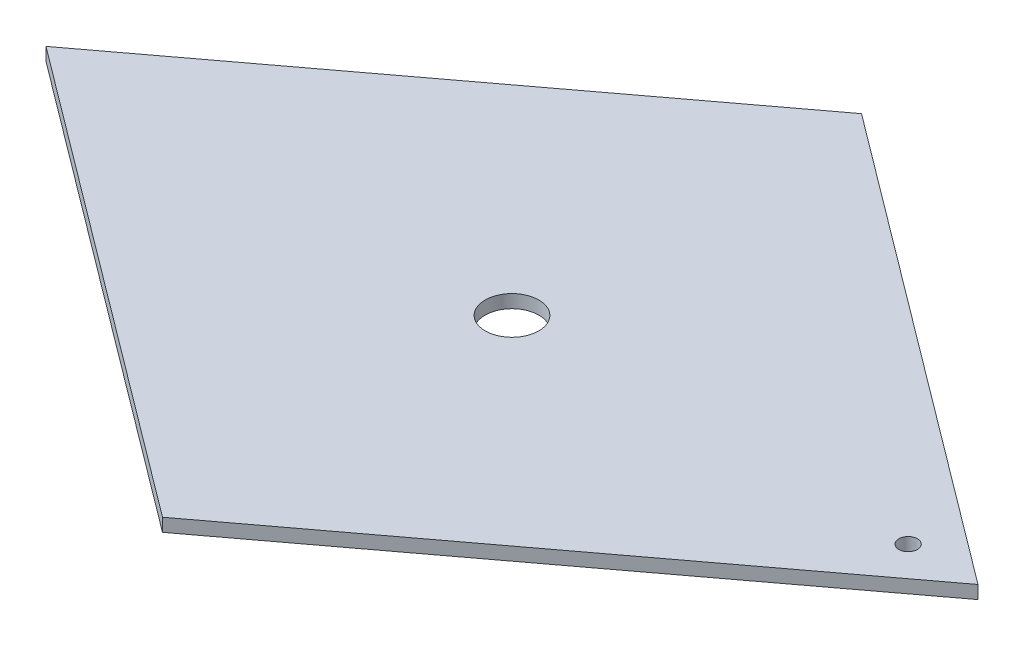
ISO-10303-21;
HEADER;
FILE_DESCRIPTION(('STEP AP214'),'2;1');
FILE_NAME('part.step','',(''),(''),'','','');
FILE_SCHEMA(('AUTOMOTIVE_DESIGN { 1 0 10303 214 1 1 1 1 }'));
ENDSEC;
DATA;
#1=APPLICATION_CONTEXT('core data for automotive mechanical design processes');
#2=APPLICATION_PROTOCOL_DEFINITION('international standard','automotive_design',2000,#1);
#3=PRODUCT_CONTEXT('',#1,'mechanical');
#4=PRODUCT('Part','Part','',(#3));
#5=PRODUCT_RELATED_PRODUCT_CATEGORY('part','',(#4));
#6=PRODUCT_DEFINITION_FORMATION('','',#4);
#7=PRODUCT_DEFINITION_CONTEXT('part definition',#1,'design');
#8=PRODUCT_DEFINITION('design','',#6,#7);
#9=PRODUCT_DEFINITION_SHAPE('','',#8);
#10=(LENGTH_UNIT() NAMED_UNIT(*) SI_UNIT(.MILLI.,.METRE.));
#11=(NAMED_UNIT(*) PLANE_ANGLE_UNIT() SI_UNIT($,.RADIAN.));
#12=(NAMED_UNIT(*) SI_UNIT($,.STERADIAN.) SOLID_ANGLE_UNIT());
#13=UNCERTAINTY_MEASURE_WITH_UNIT(LENGTH_MEASURE(1.E-05),#10,'distance_accuracy_value','');
#14=(GEOMETRIC_REPRESENTATION_CONTEXT(3) GLOBAL_UNCERTAINTY_ASSIGNED_CONTEXT((#13)) GLOBAL_UNIT_ASSIGNED_CONTEXT((#10,
#11,#12)) REPRESENTATION_CONTEXT('',''));
#15=CARTESIAN_POINT('',(0.,0.,0.));
#16=DIRECTION('',(0.,0.,1.));
#17=DIRECTION('',(1.,0.,0.));
#18=AXIS2_PLACEMENT_3D('',#15,#16,#17);
#19=CARTESIAN_POINT('',(0.,5.63,0.));
#20=DIRECTION('',(0.,-1.,0.));
#21=DIRECTION('',(0.,0.,-1.));
#22=AXIS2_PLACEMENT_3D('',#19,#20,#21);
#23=PLANE('',#22);
#24=DIRECTION('',(-0.8,0.,0.6));
#25=VECTOR('',#24,1.);
#26=CARTESIAN_POINT('',(-200.,5.63,0.));
#27=LINE('',#26,#25);
#28=CARTESIAN_POINT('',(0.,5.63,-150.));
#29=VERTEX_POINT('',#28);
#30=CARTESIAN_POINT('',(-200.,5.63,0.));
#31=VERTEX_POINT('',#30);
#32=EDGE_CURVE('E85',#29,#31,#27,.T.);
#33=ORIENTED_EDGE('',*,*,#32,.T.);
#34=DIRECTION('',(0.8,0.,0.6));
#35=VECTOR('',#34,1.);
#36=CARTESIAN_POINT('',(0.,5.63,150.));
#37=LINE('',#36,#35);
#38=CARTESIAN_POINT('',(0.,5.63,150.));
#39=VERTEX_POINT('',#38);
#40=EDGE_CURVE('E80',#31,#39,#37,.T.);
#41=ORIENTED_EDGE('',*,*,#40,.T.);
#42=DIRECTION('',(0.8,0.,-0.6));
#43=VECTOR('',#42,1.);
#44=CARTESIAN_POINT('',(200.,5.63,0.));
#45=LINE('',#44,#43);
#46=CARTESIAN_POINT('',(200.,5.63,0.));
#47=VERTEX_POINT('',#46);
#48=EDGE_CURVE('E83',#39,#47,#45,.T.);
#49=ORIENTED_EDGE('',*,*,#48,.T.);
#50=DIRECTION('',(-0.8,0.,-0.6));
#51=VECTOR('',#50,1.);
#52=CARTESIAN_POINT('',(0.,5.63,-150.));
#53=LINE('',#52,#51);
#54=EDGE_CURVE('E50',#47,#29,#53,.T.);
#55=ORIENTED_EDGE('',*,*,#54,.T.);
#56=EDGE_LOOP('',(#33,#41,#49,#55));
#57=FACE_BOUND('',#56,.T.);
#58=CARTESIAN_POINT('',(170.,5.63,0.));
#59=DIRECTION('',(0.,1.,0.));
#60=DIRECTION('',(0.,0.,1.));
#61=AXIS2_PLACEMENT_3D('',#58,#59,#60);
#62=CIRCLE('',#61,3.99999999999999);
#63=CARTESIAN_POINT('',(170.,5.63,3.99999999999999));
#64=VERTEX_POINT('',#63);
#65=EDGE_CURVE('E100',#64,#64,#62,.T.);
#66=ORIENTED_EDGE('',*,*,#65,.F.);
#67=EDGE_LOOP('',(#66));
#68=FACE_BOUND('',#67,.T.);
#69=CARTESIAN_POINT('',(0.,5.63,0.));
#70=DIRECTION('',(0.,1.,0.));
#71=DIRECTION('',(0.,0.,1.));
#72=AXIS2_PLACEMENT_3D('',#69,#70,#71);
#73=CIRCLE('',#72,11.5);
#74=CARTESIAN_POINT('',(0.,5.63,11.5));
#75=VERTEX_POINT('',#74);
#76=EDGE_CURVE('E115',#75,#75,#73,.T.);
#77=ORIENTED_EDGE('',*,*,#76,.F.);
#78=EDGE_LOOP('',(#77));
#79=FACE_BOUND('',#78,.T.);
#80=ADVANCED_FACE('F33',(#57,#68,#79),#23,.F.);
#81=CARTESIAN_POINT('',(0.,0.,0.));
#82=DIRECTION('',(0.,-1.,0.));
#83=DIRECTION('',(0.,0.,-1.));
#84=AXIS2_PLACEMENT_3D('',#81,#82,#83);
#85=PLANE('',#84);
#86=CARTESIAN_POINT('',(170.,0.,0.));
#87=DIRECTION('',(0.,1.,0.));
#88=DIRECTION('',(0.,0.,1.));
#89=AXIS2_PLACEMENT_3D('',#86,#87,#88);
#90=CIRCLE('',#89,3.99999999999999);
#91=CARTESIAN_POINT('',(170.,0.,3.99999999999999));
#92=VERTEX_POINT('',#91);
#93=EDGE_CURVE('E112',#92,#92,#90,.T.);
#94=ORIENTED_EDGE('',*,*,#93,.T.);
#95=EDGE_LOOP('',(#94));
#96=FACE_BOUND('',#95,.T.);
#97=DIRECTION('',(-0.8,0.,0.6));
#98=VECTOR('',#97,1.);
#99=CARTESIAN_POINT('',(-200.,0.,0.));
#100=LINE('',#99,#98);
#101=CARTESIAN_POINT('',(0.,0.,-150.));
#102=VERTEX_POINT('',#101);
#103=CARTESIAN_POINT('',(-200.,0.,0.));
#104=VERTEX_POINT('',#103);
#105=EDGE_CURVE('E97',#102,#104,#100,.T.);
#106=ORIENTED_EDGE('',*,*,#105,.F.);
#107=DIRECTION('',(-0.8,0.,-0.6));
#108=VECTOR('',#107,1.);
#109=CARTESIAN_POINT('',(0.,0.,-150.));
#110=LINE('',#109,#108);
#111=CARTESIAN_POINT('',(200.,0.,0.));
#112=VERTEX_POINT('',#111);
#113=EDGE_CURVE('E73',#112,#102,#110,.T.);
#114=ORIENTED_EDGE('',*,*,#113,.F.);
#115=DIRECTION('',(0.8,0.,-0.6));
#116=VECTOR('',#115,1.);
#117=CARTESIAN_POINT('',(200.,0.,0.));
#118=LINE('',#117,#116);
#119=CARTESIAN_POINT('',(0.,0.,150.));
#120=VERTEX_POINT('',#119);
#121=EDGE_CURVE('E67',#120,#112,#118,.T.);
#122=ORIENTED_EDGE('',*,*,#121,.F.);
#123=DIRECTION('',(0.8,0.,0.6));
#124=VECTOR('',#123,1.);
#125=CARTESIAN_POINT('',(0.,0.,150.));
#126=LINE('',#125,#124);
#127=EDGE_CURVE('E89',#104,#120,#126,.T.);
#128=ORIENTED_EDGE('',*,*,#127,.F.);
#129=EDGE_LOOP('',(#106,#114,#122,#128));
#130=FACE_BOUND('',#129,.T.);
#131=CARTESIAN_POINT('',(0.,0.,0.));
#132=DIRECTION('',(0.,1.,0.));
#133=DIRECTION('',(0.,0.,1.));
#134=AXIS2_PLACEMENT_3D('',#131,#132,#133);
#135=CIRCLE('',#134,11.5);
#136=CARTESIAN_POINT('',(0.,0.,11.5));
#137=VERTEX_POINT('',#136);
#138=EDGE_CURVE('E118',#137,#137,#135,.T.);
#139=ORIENTED_EDGE('',*,*,#138,.T.);
#140=EDGE_LOOP('',(#139));
#141=FACE_BOUND('',#140,.T.);
#142=ADVANCED_FACE('F108',(#96,#130,#141),#85,.T.);
#143=CARTESIAN_POINT('',(-200.,5.63,0.));
#144=DIRECTION('',(0.6,0.,0.8));
#145=DIRECTION('',(0.8,0.,-0.6));
#146=AXIS2_PLACEMENT_3D('',#143,#144,#145);
#147=PLANE('',#146);
#148=ORIENTED_EDGE('',*,*,#105,.T.);
#149=DIRECTION('',(0.,-1.,0.));
#150=VECTOR('',#149,1.);
#151=CARTESIAN_POINT('',(-200.,5.63,0.));
#152=LINE('',#151,#150);
#153=EDGE_CURVE('E11',#31,#104,#152,.T.);
#154=ORIENTED_EDGE('',*,*,#153,.F.);
#155=ORIENTED_EDGE('',*,*,#32,.F.);
#156=DIRECTION('',(0.,-1.,0.));
#157=VECTOR('',#156,1.);
#158=CARTESIAN_POINT('',(0.,5.63,-150.));
#159=LINE('',#158,#157);
#160=EDGE_CURVE('E93',#29,#102,#159,.T.);
#161=ORIENTED_EDGE('',*,*,#160,.T.);
#162=EDGE_LOOP('',(#148,#154,#155,#161));
#163=FACE_BOUND('',#162,.T.);
#164=ADVANCED_FACE('F35',(#163),#147,.F.);
#165=CARTESIAN_POINT('',(0.,5.63,150.));
#166=DIRECTION('',(0.6,0.,-0.8));
#167=DIRECTION('',(-0.8,0.,-0.6));
#168=AXIS2_PLACEMENT_3D('',#165,#166,#167);
#169=PLANE('',#168);
#170=ORIENTED_EDGE('',*,*,#127,.T.);
#171=DIRECTION('',(0.,-1.,0.));
#172=VECTOR('',#171,1.);
#173=CARTESIAN_POINT('',(0.,5.63,150.));
#174=LINE('',#173,#172);
#175=EDGE_CURVE('E42',#39,#120,#174,.T.);
#176=ORIENTED_EDGE('',*,*,#175,.F.);
#177=ORIENTED_EDGE('',*,*,#40,.F.);
#178=ORIENTED_EDGE('',*,*,#153,.T.);
#179=EDGE_LOOP('',(#170,#176,#177,#178));
#180=FACE_BOUND('',#179,.T.);
#181=ADVANCED_FACE('F88',(#180),#169,.F.);
#182=CARTESIAN_POINT('',(200.,5.63,0.));
#183=DIRECTION('',(-0.6,0.,-0.8));
#184=DIRECTION('',(-0.8,0.,0.6));
#185=AXIS2_PLACEMENT_3D('',#182,#183,#184);
#186=PLANE('',#185);
#187=ORIENTED_EDGE('',*,*,#121,.T.);
#188=DIRECTION('',(0.,-1.,0.));
#189=VECTOR('',#188,1.);
#190=CARTESIAN_POINT('',(200.,5.63,0.));
#191=LINE('',#190,#189);
#192=EDGE_CURVE('E90',#47,#112,#191,.T.);
#193=ORIENTED_EDGE('',*,*,#192,.F.);
#194=ORIENTED_EDGE('',*,*,#48,.F.);
#195=ORIENTED_EDGE('',*,*,#175,.T.);
#196=EDGE_LOOP('',(#187,#193,#194,#195));
#197=FACE_BOUND('',#196,.T.);
#198=ADVANCED_FACE('F91',(#197),#186,.F.);
#199=CARTESIAN_POINT('',(0.,5.63,-150.));
#200=DIRECTION('',(-0.6,0.,0.8));
#201=DIRECTION('',(0.8,0.,0.6));
#202=AXIS2_PLACEMENT_3D('',#199,#200,#201);
#203=PLANE('',#202);
#204=ORIENTED_EDGE('',*,*,#113,.T.);
#205=ORIENTED_EDGE('',*,*,#160,.F.);
#206=ORIENTED_EDGE('',*,*,#54,.F.);
#207=ORIENTED_EDGE('',*,*,#192,.T.);
#208=EDGE_LOOP('',(#204,#205,#206,#207));
#209=FACE_BOUND('',#208,.T.);
#210=ADVANCED_FACE('F105',(#209),#203,.F.);
#211=CARTESIAN_POINT('',(170.,5.63,0.));
#212=DIRECTION('',(0.,-1.,0.));
#213=DIRECTION('',(0.,0.,-1.));
#214=AXIS2_PLACEMENT_3D('',#211,#212,#213);
#215=CYLINDRICAL_SURFACE('',#214,3.99999999999999);
#216=ORIENTED_EDGE('',*,*,#65,.T.);
#217=EDGE_LOOP('',(#216));
#218=FACE_BOUND('',#217,.T.);
#219=ORIENTED_EDGE('',*,*,#93,.F.);
#220=EDGE_LOOP('',(#219));
#221=FACE_BOUND('',#220,.T.);
#222=ADVANCED_FACE('F135',(#218,#221),#215,.F.);
#223=CARTESIAN_POINT('',(0.,5.63,0.));
#224=DIRECTION('',(0.,-1.,0.));
#225=DIRECTION('',(0.,0.,-1.));
#226=AXIS2_PLACEMENT_3D('',#223,#224,#225);
#227=CYLINDRICAL_SURFACE('',#226,11.5);
#228=ORIENTED_EDGE('',*,*,#76,.T.);
#229=EDGE_LOOP('',(#228));
#230=FACE_BOUND('',#229,.T.);
#231=ORIENTED_EDGE('',*,*,#138,.F.);
#232=EDGE_LOOP('',(#231));
#233=FACE_BOUND('',#232,.T.);
#234=ADVANCED_FACE('F124',(#230,#233),#227,.F.);
#235=CLOSED_SHELL('',(#80,#142,#164,#181,#198,#210,#222,#234));
#236=MANIFOLD_SOLID_BREP('B2',#235);
#237=ADVANCED_BREP_SHAPE_REPRESENTATION('',(#18,#236),#14);
#238=SHAPE_DEFINITION_REPRESENTATION(#9,#237);
ENDSEC;
END-ISO-10303-21;
